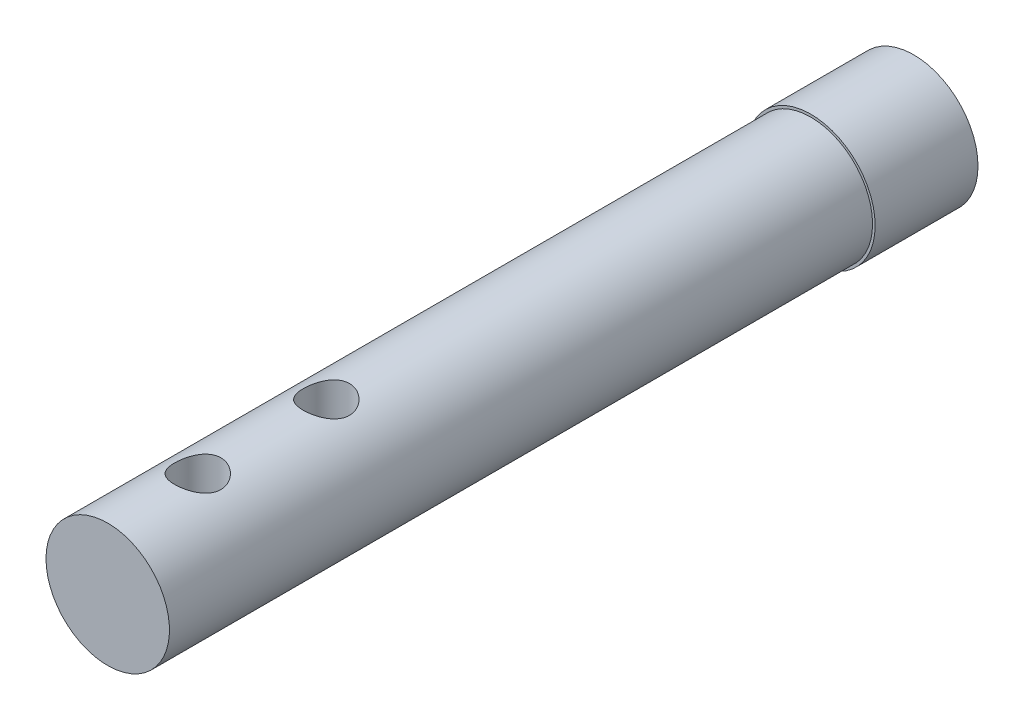
ISO-10303-21;
HEADER;
FILE_DESCRIPTION(('STEP AP214'),'2;1');
FILE_NAME('part.step','',(''),(''),'','','');
FILE_SCHEMA(('AUTOMOTIVE_DESIGN { 1 0 10303 214 1 1 1 1 }'));
ENDSEC;
DATA;
#1=APPLICATION_CONTEXT('core data for automotive mechanical design processes');
#2=APPLICATION_PROTOCOL_DEFINITION('international standard','automotive_design',2000,#1);
#3=PRODUCT_CONTEXT('',#1,'mechanical');
#4=PRODUCT('Part','Part','',(#3));
#5=PRODUCT_RELATED_PRODUCT_CATEGORY('part','',(#4));
#6=PRODUCT_DEFINITION_FORMATION('','',#4);
#7=PRODUCT_DEFINITION_CONTEXT('part definition',#1,'design');
#8=PRODUCT_DEFINITION('design','',#6,#7);
#9=PRODUCT_DEFINITION_SHAPE('','',#8);
#10=(LENGTH_UNIT() NAMED_UNIT(*) SI_UNIT(.MILLI.,.METRE.));
#11=(NAMED_UNIT(*) PLANE_ANGLE_UNIT() SI_UNIT($,.RADIAN.));
#12=(NAMED_UNIT(*) SI_UNIT($,.STERADIAN.) SOLID_ANGLE_UNIT());
#13=UNCERTAINTY_MEASURE_WITH_UNIT(LENGTH_MEASURE(1.E-05),#10,'distance_accuracy_value','');
#14=(GEOMETRIC_REPRESENTATION_CONTEXT(3) GLOBAL_UNCERTAINTY_ASSIGNED_CONTEXT((#13)) GLOBAL_UNIT_ASSIGNED_CONTEXT((#10,
#11,#12)) REPRESENTATION_CONTEXT('',''));
#15=CARTESIAN_POINT('',(0.,0.,0.));
#16=DIRECTION('',(0.,0.,1.));
#17=DIRECTION('',(1.,0.,0.));
#18=AXIS2_PLACEMENT_3D('',#15,#16,#17);
#19=CARTESIAN_POINT('',(0.,0.,35.));
#20=DIRECTION('',(0.,0.,-1.));
#21=DIRECTION('',(-1.,0.,0.));
#22=AXIS2_PLACEMENT_3D('',#19,#20,#21);
#23=CYLINDRICAL_SURFACE('',#22,12.5);
#24=CARTESIAN_POINT('',(0.,0.,35.));
#25=DIRECTION('',(0.,0.,1.));
#26=DIRECTION('',(1.,0.,0.));
#27=AXIS2_PLACEMENT_3D('',#24,#25,#26);
#28=CIRCLE('',#27,12.5);
#29=CARTESIAN_POINT('',(12.5,0.,35.));
#30=VERTEX_POINT('',#29);
#31=EDGE_CURVE('E42',#30,#30,#28,.T.);
#32=ORIENTED_EDGE('',*,*,#31,.F.);
#33=EDGE_LOOP('',(#32));
#34=FACE_BOUND('',#33,.T.);
#35=CARTESIAN_POINT('',(0.,0.,15.));
#36=DIRECTION('',(0.,0.,1.));
#37=DIRECTION('',(1.,0.,0.));
#38=AXIS2_PLACEMENT_3D('',#35,#36,#37);
#39=CIRCLE('',#38,12.5);
#40=CARTESIAN_POINT('',(12.5,0.,15.));
#41=VERTEX_POINT('',#40);
#42=EDGE_CURVE('E47',#41,#41,#39,.T.);
#43=ORIENTED_EDGE('',*,*,#42,.T.);
#44=EDGE_LOOP('',(#43));
#45=FACE_BOUND('',#44,.T.);
#46=ADVANCED_FACE('F35',(#34,#45),#23,.T.);
#47=CARTESIAN_POINT('',(0.,0.,35.));
#48=DIRECTION('',(0.,0.,1.));
#49=DIRECTION('',(1.,0.,0.));
#50=AXIS2_PLACEMENT_3D('',#47,#48,#49);
#51=PLANE('',#50);
#52=CARTESIAN_POINT('',(0.,0.,35.));
#53=DIRECTION('',(0.,0.,1.));
#54=DIRECTION('',(1.,0.,0.));
#55=AXIS2_PLACEMENT_3D('',#52,#53,#54);
#56=CIRCLE('',#55,12.);
#57=CARTESIAN_POINT('',(12.,0.,35.));
#58=VERTEX_POINT('',#57);
#59=EDGE_CURVE('E10',#58,#58,#56,.T.);
#60=ORIENTED_EDGE('',*,*,#59,.F.);
#61=EDGE_LOOP('',(#60));
#62=FACE_BOUND('',#61,.T.);
#63=ORIENTED_EDGE('',*,*,#31,.T.);
#64=EDGE_LOOP('',(#63));
#65=FACE_BOUND('',#64,.T.);
#66=ADVANCED_FACE('F103',(#62,#65),#51,.T.);
#67=CARTESIAN_POINT('',(0.,0.,15.));
#68=DIRECTION('',(0.,0.,1.));
#69=DIRECTION('',(1.,0.,0.));
#70=AXIS2_PLACEMENT_3D('',#67,#68,#69);
#71=PLANE('',#70);
#72=ORIENTED_EDGE('',*,*,#42,.F.);
#73=EDGE_LOOP('',(#72));
#74=FACE_BOUND('',#73,.T.);
#75=ADVANCED_FACE('F108',(#74),#71,.F.);
#76=CARTESIAN_POINT('',(0.,0.,174.2));
#77=DIRECTION('',(0.,0.,-1.));
#78=DIRECTION('',(-1.,0.,0.));
#79=AXIS2_PLACEMENT_3D('',#76,#77,#78);
#80=CYLINDRICAL_SURFACE('',#79,12.);
#81=CARTESIAN_POINT('',(0.,0.,171.7));
#82=DIRECTION('',(0.,0.,-1.));
#83=DIRECTION('',(-1.,0.,0.));
#84=AXIS2_PLACEMENT_3D('',#81,#82,#83);
#85=CIRCLE('',#84,12.);
#86=CARTESIAN_POINT('',(-12.,0.,171.7));
#87=VERTEX_POINT('',#86);
#88=EDGE_CURVE('E38',#87,#87,#85,.T.);
#89=ORIENTED_EDGE('',*,*,#88,.T.);
#90=EDGE_LOOP('',(#89));
#91=FACE_BOUND('',#90,.T.);
#92=CARTESIAN_POINT('',(0.,-12.,133.7));
#93=CARTESIAN_POINT('',(0.121821920216141,-12.0000004149463,133.700000562589));
#94=CARTESIAN_POINT('',(0.243636002691335,-11.9981409348073,133.695049364538));
#95=CARTESIAN_POINT('',(0.486392423781216,-11.9907535477711,133.675293911887));
#96=CARTESIAN_POINT('',(0.607334471202253,-11.9852244680872,133.660486507286));
#97=CARTESIAN_POINT('',(0.847347381687188,-11.970649565472,133.621174413436));
#98=CARTESIAN_POINT('',(0.966419205128135,-11.9616056132673,133.596674882519));
#99=CARTESIAN_POINT('',(1.2019581040135,-11.9402382455256,133.53820576059));
#100=CARTESIAN_POINT('',(1.31842414848255,-11.9279135559973,133.504232490447));
#101=CARTESIAN_POINT('',(1.54765442429004,-11.9003384511568,133.427214849951));
#102=CARTESIAN_POINT('',(1.66042673449101,-11.8850950009216,133.384192050998));
#103=CARTESIAN_POINT('',(1.88185705605879,-11.8520536393113,133.289393964956));
#104=CARTESIAN_POINT('',(1.99051352350809,-11.8342547811235,133.237615432482));
#105=CARTESIAN_POINT('',(2.30927279411985,-11.7776768093622,133.069731594457));
#106=CARTESIAN_POINT('',(2.51234231941558,-11.7356939966761,132.941018203868));
#107=CARTESIAN_POINT('',(2.90206977477989,-11.6455850212357,132.648156633399));
#108=CARTESIAN_POINT('',(3.08780172063125,-11.5972851945296,132.482840477992));
#109=CARTESIAN_POINT('',(3.42974311725175,-11.500801507554,132.123737421702));
#110=CARTESIAN_POINT('',(3.58594353155377,-11.4526176872201,131.929941838426));
#111=CARTESIAN_POINT('',(3.79764477617944,-11.3834841407686,131.617559070828));
#112=CARTESIAN_POINT('',(3.86547493196535,-11.3605705131175,131.507562616254));
#113=CARTESIAN_POINT('',(3.99157408188856,-11.3168804194774,131.281831512047));
#114=CARTESIAN_POINT('',(4.04984690983616,-11.2961030977882,131.166099187672));
#115=CARTESIAN_POINT('',(4.15634309619244,-11.257354412399,130.929634242611));
#116=CARTESIAN_POINT('',(4.20456527896397,-11.2393833770156,130.808901038945));
#117=CARTESIAN_POINT('',(4.29047551547084,-11.2068698048304,130.563350953977));
#118=CARTESIAN_POINT('',(4.32816865016454,-11.1923256148824,130.438536074949));
#119=CARTESIAN_POINT('',(4.3913383306389,-11.167687799886,130.190864282486));
#120=CARTESIAN_POINT('',(4.41724869222401,-11.1574374723367,130.068133574559));
#121=CARTESIAN_POINT('',(4.45874705417236,-11.1409189584307,129.820724885637));
#122=CARTESIAN_POINT('',(4.47433956871922,-11.1346490306496,129.696047780687));
#123=CARTESIAN_POINT('',(4.49504192825722,-11.1263077224061,129.445703904304));
#124=CARTESIAN_POINT('',(4.50015334189904,-11.124235713664,129.320037283793));
#125=CARTESIAN_POINT('',(4.4998396408155,-11.124362586323,129.068723898627));
#126=CARTESIAN_POINT('',(4.49441493477359,-11.1265613020677,128.94307713339));
#127=CARTESIAN_POINT('',(4.47373138181252,-11.1348931002806,128.700345583509));
#128=CARTESIAN_POINT('',(4.45908334347361,-11.1407817124043,128.583200175152));
#129=CARTESIAN_POINT('',(4.42068867776497,-11.1560711786316,128.350631735769));
#130=CARTESIAN_POINT('',(4.39693902815624,-11.1654731993557,128.235209290103));
#131=CARTESIAN_POINT('',(4.31234407385654,-11.1985472030748,127.892770983112));
#132=CARTESIAN_POINT('',(4.23813423625877,-11.2270952052095,127.669371280221));
#133=CARTESIAN_POINT('',(4.05490721343478,-11.294571324263,127.234132319446));
#134=CARTESIAN_POINT('',(3.94525805379047,-11.3336856090865,127.02259174478));
#135=CARTESIAN_POINT('',(3.69468362169031,-11.417826234714,126.620172587469));
#136=CARTESIAN_POINT('',(3.55374755073013,-11.4628546145386,126.429301172593));
#137=CARTESIAN_POINT('',(3.23345300799872,-11.5574411862383,126.060186122089));
#138=CARTESIAN_POINT('',(3.05214885027355,-11.607100429164,125.88365330368));
#139=CARTESIAN_POINT('',(2.66193788370924,-11.7027518394278,125.562986875577));
#140=CARTESIAN_POINT('',(2.45302684040981,-11.7487434424691,125.418858245353));
#141=CARTESIAN_POINT('',(2.00917028059687,-11.8327918458053,125.165208596408));
#142=CARTESIAN_POINT('',(1.77387213379261,-11.8707149483013,125.056257198474));
#143=CARTESIAN_POINT('',(1.28651055931184,-11.9333615492963,124.880052245027));
#144=CARTESIAN_POINT('',(1.03445463312944,-11.9580909097264,124.8127801694));
#145=CARTESIAN_POINT('',(0.535125728885334,-11.9905332973328,124.725131619306));
#146=CARTESIAN_POINT('',(0.288310863440804,-11.9990810722223,124.702452162351));
#147=CARTESIAN_POINT('',(-0.205717430518202,-12.0007768095524,124.697926826798));
#148=CARTESIAN_POINT('',(-0.452930758520925,-11.9939281862917,124.716071894972));
#149=CARTESIAN_POINT('',(-0.930786126866781,-11.9661512982893,124.790930073153));
#150=CARTESIAN_POINT('',(-1.16169991458787,-11.9457741475744,124.846134437354));
#151=CARTESIAN_POINT('',(-1.61082533431484,-11.8935442940439,124.991558411525));
#152=CARTESIAN_POINT('',(-1.82903531000968,-11.8616900987367,125.081782575637));
#153=CARTESIAN_POINT('',(-2.25374302875422,-11.7884888040033,125.297558494317));
#154=CARTESIAN_POINT('',(-2.45970824228689,-11.7468902777666,125.424070377444));
#155=CARTESIAN_POINT('',(-2.8481791439392,-11.6587998753534,125.70775712078));
#156=CARTESIAN_POINT('',(-3.03067612982123,-11.6123061955645,125.864943301224));
#157=CARTESIAN_POINT('',(-3.37808840855275,-11.516200958323,126.216201253386));
#158=CARTESIAN_POINT('',(-3.54136933947529,-11.4665650100461,126.411883953797));
#159=CARTESIAN_POINT('',(-3.8331467865608,-11.372360357102,126.828996752467));
#160=CARTESIAN_POINT('',(-3.96164017919756,-11.3277921076647,127.050429160208));
#161=CARTESIAN_POINT('',(-4.12541953452076,-11.2687303690453,127.397922796397));
#162=CARTESIAN_POINT('',(-4.17527938653559,-11.2503030894951,127.516647329586));
#163=CARTESIAN_POINT('',(-4.26475585416723,-11.2166905930926,127.758323845116));
#164=CARTESIAN_POINT('',(-4.30437682733462,-11.2015039975232,127.881274003754));
#165=CARTESIAN_POINT('',(-4.37296242168506,-11.1749073223601,128.130466472104));
#166=CARTESIAN_POINT('',(-4.40193024471254,-11.163496108165,128.256707780413));
#167=CARTESIAN_POINT('',(-4.44890662829911,-11.1448585297206,128.51151813959));
#168=CARTESIAN_POINT('',(-4.46691595320739,-11.1376318736025,128.640087027466));
#169=CARTESIAN_POINT('',(-4.4909611175474,-11.1279568107625,128.890138338187));
#170=CARTESIAN_POINT('',(-4.4976937576826,-11.1252304971503,129.011543515748));
#171=CARTESIAN_POINT('',(-4.50131029580419,-11.1237678185175,129.254568299403));
#172=CARTESIAN_POINT('',(-4.49819087218451,-11.1250327991546,129.376187963996));
#173=CARTESIAN_POINT('',(-4.48213280066959,-11.131512007523,129.618611778483));
#174=CARTESIAN_POINT('',(-4.46919877710471,-11.1367243753675,129.739416285416));
#175=CARTESIAN_POINT('',(-4.4336489114592,-11.150924738849,129.979410101132));
#176=CARTESIAN_POINT('',(-4.41102942370239,-11.1599141561698,130.098598784262));
#177=CARTESIAN_POINT('',(-4.35718066722756,-11.1810458214159,130.330811506595));
#178=CARTESIAN_POINT('',(-4.32623979458421,-11.1930817833517,130.443912139277));
#179=CARTESIAN_POINT('',(-4.25575591081443,-11.220069483486,130.667056271898));
#180=CARTESIAN_POINT('',(-4.216209885475,-11.23502224319,130.777098685333));
#181=CARTESIAN_POINT('',(-4.08512625929659,-11.2836374066331,131.101595505612));
#182=CARTESIAN_POINT('',(-3.98110253179988,-11.3210734609741,131.310592817196));
#183=CARTESIAN_POINT('',(-3.73655960136618,-11.4041928736043,131.719509886323));
#184=CARTESIAN_POINT('',(-3.59441315608531,-11.4502056852775,131.918379513829));
#185=CARTESIAN_POINT('',(-3.28000639093494,-11.5441926723435,132.290437563583));
#186=CARTESIAN_POINT('',(-3.10773650011229,-11.5921674673836,132.463617791262));
#187=CARTESIAN_POINT('',(-2.82485495768736,-11.6632064644304,132.705245875948));
#188=CARTESIAN_POINT('',(-2.72355677041139,-11.6873329442322,132.784523984934));
#189=CARTESIAN_POINT('',(-2.5143325103599,-11.7341212355869,132.934254321495));
#190=CARTESIAN_POINT('',(-2.40640888366377,-11.7567835814237,133.004709777492));
#191=CARTESIAN_POINT('',(-2.18454509687348,-11.8000231112314,133.136294134108));
#192=CARTESIAN_POINT('',(-2.07060177268691,-11.8205991816831,133.197418062869));
#193=CARTESIAN_POINT('',(-1.83755175113718,-11.8590616275344,133.309759993606));
#194=CARTESIAN_POINT('',(-1.71844727331547,-11.8769491446375,133.36098220304));
#195=CARTESIAN_POINT('',(-1.47053797162902,-11.9102407175975,133.455097964792));
#196=CARTESIAN_POINT('',(-1.34153686175291,-11.9255011706843,133.497526838323));
#197=CARTESIAN_POINT('',(-1.07989915577463,-11.9520331999052,133.570612963128));
#198=CARTESIAN_POINT('',(-0.947264179674953,-11.9633065233273,133.601275371348));
#199=CARTESIAN_POINT('',(-0.679492491904581,-11.9814979813589,133.650485060083));
#200=CARTESIAN_POINT('',(-0.544356226207072,-11.9884168847946,133.669034479318));
#201=CARTESIAN_POINT('',(-0.272809934790551,-11.9976674031164,133.693790938277));
#202=CARTESIAN_POINT('',(-0.136400054481801,-11.9999995353981,133.699999370088));
#203=CARTESIAN_POINT('',(0.,-12.,133.7));
#204=B_SPLINE_CURVE_WITH_KNOTS('',3,(#92,#93,#94,#95,#96,#97,#98,#99,#100,#101,#102,#103,#104,
#105,#106,#107,#108,#109,#110,#111,#112,#113,#114,#115,#116,#117,#118,#119,#120,#121,#122,#123,
#124,#125,#126,#127,#128,#129,#130,#131,#132,#133,#134,#135,#136,#137,#138,#139,#140,#141,#142,
#143,#144,#145,#146,#147,#148,#149,#150,#151,#152,#153,#154,#155,#156,#157,#158,#159,#160,#161,
#162,#163,#164,#165,#166,#167,#168,#169,#170,#171,#172,#173,#174,#175,#176,#177,#178,#179,#180,
#181,#182,#183,#184,#185,#186,#187,#188,#189,#190,#191,#192,#193,#194,#195,#196,#197,#198,#199,
#200,#201,#202,#203),.UNSPECIFIED.,.T.,.F.,(4,2,2,2,2,2,2,2,2,2,2,2,2,2,2,2,2,2,2,2,2,2,2,2,2,2,
2,2,2,2,2,2,2,2,2,2,2,2,2,2,2,2,2,2,2,2,2,2,2,2,2,2,2,2,2,4),(0.,0.365338024506953,
0.730792865566528,1.09605346575198,1.46145611308566,1.82599742407275,2.19067415273864,
2.91947018392637,3.67616860257937,4.43309819286657,4.82642681378567,5.21959726757261,
5.6128136852447,6.00584002102328,6.38291145568139,6.75981780772976,7.13666774608809,
7.5135030671805,7.86768402280124,8.22198268815958,8.92994647641832,9.65130458621122,
10.3729120569284,11.143016934675,11.9132400717527,12.6953735931829,13.477159325566,
14.2173829236784,14.9574423863163,15.6690654723159,16.3807811322343,17.1134089903886,
17.8463077351967,18.6217279182704,19.3972177022049,19.7870381951626,20.1766925107005,
20.5662296182681,20.9557395527225,21.3201489316714,21.6846811837187,22.0490417862153,
22.4135396573091,22.7667469946614,23.1200782532196,23.8262105801188,24.5693581369517,
25.3127422403355,25.7049754844993,26.0970647789657,26.4893622558027,26.8814926686161,
27.2908478409866,27.7000233978563,28.1091266894863,28.5181838309154),.UNSPECIFIED.);
#205=CARTESIAN_POINT('',(0.,-12.,133.7));
#206=VERTEX_POINT('',#205);
#207=EDGE_CURVE('E61',#206,#206,#204,.T.);
#208=ORIENTED_EDGE('',*,*,#207,.T.);
#209=EDGE_LOOP('',(#208));
#210=FACE_BOUND('',#209,.T.);
#211=CARTESIAN_POINT('',(0.,12.,133.7));
#212=CARTESIAN_POINT('',(-0.121821920216148,12.0000004149463,133.700000562589));
#213=CARTESIAN_POINT('',(-0.243636002691342,11.9981409348073,133.695049364538));
#214=CARTESIAN_POINT('',(-0.486392423781223,11.9907535477711,133.675293911887));
#215=CARTESIAN_POINT('',(-0.60733447120226,11.9852244680872,133.660486507286));
#216=CARTESIAN_POINT('',(-0.847347381687196,11.970649565472,133.621174413436));
#217=CARTESIAN_POINT('',(-0.966419205128143,11.9616056132673,133.596674882519));
#218=CARTESIAN_POINT('',(-1.20195810401351,11.9402382455256,133.53820576059));
#219=CARTESIAN_POINT('',(-1.31842414848256,11.9279135559973,133.504232490447));
#220=CARTESIAN_POINT('',(-1.54765442429005,11.9003384511568,133.427214849951));
#221=CARTESIAN_POINT('',(-1.66042673449102,11.8850950009216,133.384192050998));
#222=CARTESIAN_POINT('',(-1.88185705605881,11.8520536393113,133.289393964956));
#223=CARTESIAN_POINT('',(-1.9905135235081,11.8342547811235,133.237615432482));
#224=CARTESIAN_POINT('',(-2.30927279411986,11.7776768093622,133.069731594457));
#225=CARTESIAN_POINT('',(-2.51234231941559,11.7356939966761,132.941018203868));
#226=CARTESIAN_POINT('',(-2.9020697747799,11.6455850212357,132.648156633399));
#227=CARTESIAN_POINT('',(-3.08780172063126,11.5972851945296,132.482840477992));
#228=CARTESIAN_POINT('',(-3.42974311725176,11.500801507554,132.123737421702));
#229=CARTESIAN_POINT('',(-3.58594353155377,11.4526176872201,131.929941838426));
#230=CARTESIAN_POINT('',(-3.79764477617945,11.3834841407686,131.617559070828));
#231=CARTESIAN_POINT('',(-3.86547493196536,11.3605705131175,131.507562616254));
#232=CARTESIAN_POINT('',(-3.99157408188856,11.3168804194774,131.281831512047));
#233=CARTESIAN_POINT('',(-4.04984690983617,11.2961030977882,131.166099187672));
#234=CARTESIAN_POINT('',(-4.15634309619245,11.257354412399,130.929634242611));
#235=CARTESIAN_POINT('',(-4.20456527896398,11.2393833770156,130.808901038945));
#236=CARTESIAN_POINT('',(-4.29047551547085,11.2068698048304,130.563350953977));
#237=CARTESIAN_POINT('',(-4.32816865016455,11.1923256148824,130.438536074949));
#238=CARTESIAN_POINT('',(-4.3913383306389,11.167687799886,130.190864282486));
#239=CARTESIAN_POINT('',(-4.41724869222402,11.1574374723367,130.068133574559));
#240=CARTESIAN_POINT('',(-4.45874705417237,11.1409189584307,129.820724885637));
#241=CARTESIAN_POINT('',(-4.47433956871923,11.1346490306496,129.696047780687));
#242=CARTESIAN_POINT('',(-4.49504192825722,11.1263077224061,129.445703904304));
#243=CARTESIAN_POINT('',(-4.50015334189905,11.124235713664,129.320037283793));
#244=CARTESIAN_POINT('',(-4.49983964081551,11.124362586323,129.068723898627));
#245=CARTESIAN_POINT('',(-4.4944149347736,11.1265613020677,128.94307713339));
#246=CARTESIAN_POINT('',(-4.47373138181252,11.1348931002806,128.700345583509));
#247=CARTESIAN_POINT('',(-4.45908334347362,11.1407817124043,128.583200175152));
#248=CARTESIAN_POINT('',(-4.42068867776498,11.1560711786316,128.350631735769));
#249=CARTESIAN_POINT('',(-4.39693902815624,11.1654731993557,128.235209290103));
#250=CARTESIAN_POINT('',(-4.31234407385655,11.1985472030748,127.892770983112));
#251=CARTESIAN_POINT('',(-4.23813423625877,11.2270952052095,127.669371280221));
#252=CARTESIAN_POINT('',(-4.05490721343479,11.294571324263,127.234132319446));
#253=CARTESIAN_POINT('',(-3.94525805379048,11.3336856090865,127.02259174478));
#254=CARTESIAN_POINT('',(-3.69468362169032,11.417826234714,126.620172587469));
#255=CARTESIAN_POINT('',(-3.55374755073014,11.4628546145386,126.429301172593));
#256=CARTESIAN_POINT('',(-3.23345300799872,11.5574411862383,126.060186122089));
#257=CARTESIAN_POINT('',(-3.05214885027355,11.607100429164,125.88365330368));
#258=CARTESIAN_POINT('',(-2.66193788370925,11.7027518394278,125.562986875577));
#259=CARTESIAN_POINT('',(-2.45302684040981,11.7487434424691,125.418858245353));
#260=CARTESIAN_POINT('',(-2.00917028059688,11.8327918458053,125.165208596408));
#261=CARTESIAN_POINT('',(-1.77387213379261,11.8707149483013,125.056257198474));
#262=CARTESIAN_POINT('',(-1.28651055931184,11.9333615492963,124.880052245027));
#263=CARTESIAN_POINT('',(-1.03445463312944,11.9580909097264,124.8127801694));
#264=CARTESIAN_POINT('',(-0.535125728885343,11.9905332973328,124.725131619306));
#265=CARTESIAN_POINT('',(-0.288310863440812,11.9990810722223,124.702452162351));
#266=CARTESIAN_POINT('',(0.205717430518194,12.0007768095524,124.697926826798));
#267=CARTESIAN_POINT('',(0.452930758520917,11.9939281862917,124.716071894972));
#268=CARTESIAN_POINT('',(0.930786126866772,11.9661512982893,124.790930073153));
#269=CARTESIAN_POINT('',(1.16169991458786,11.9457741475744,124.846134437354));
#270=CARTESIAN_POINT('',(1.61082533431484,11.8935442940439,124.991558411525));
#271=CARTESIAN_POINT('',(1.82903531000967,11.8616900987367,125.081782575637));
#272=CARTESIAN_POINT('',(2.25374302875422,11.7884888040033,125.297558494317));
#273=CARTESIAN_POINT('',(2.45970824228691,11.7468902777666,125.424070377444));
#274=CARTESIAN_POINT('',(2.84817914393921,11.6587998753534,125.70775712078));
#275=CARTESIAN_POINT('',(3.03067612982124,11.6123061955645,125.864943301224));
#276=CARTESIAN_POINT('',(3.37808840855274,11.516200958323,126.216201253386));
#277=CARTESIAN_POINT('',(3.54136933947528,11.4665650100462,126.411883953797));
#278=CARTESIAN_POINT('',(3.8331467865608,11.372360357102,126.828996752467));
#279=CARTESIAN_POINT('',(3.96164017919755,11.3277921076647,127.050429160208));
#280=CARTESIAN_POINT('',(4.12541953452075,11.2687303690453,127.397922796397));
#281=CARTESIAN_POINT('',(4.17527938653558,11.2503030894951,127.516647329586));
#282=CARTESIAN_POINT('',(4.26475585416722,11.2166905930926,127.758323845116));
#283=CARTESIAN_POINT('',(4.30437682733461,11.2015039975232,127.881274003754));
#284=CARTESIAN_POINT('',(4.37296242168505,11.1749073223601,128.130466472104));
#285=CARTESIAN_POINT('',(4.40193024471254,11.163496108165,128.256707780413));
#286=CARTESIAN_POINT('',(4.44890662829911,11.1448585297206,128.51151813959));
#287=CARTESIAN_POINT('',(4.46691595320738,11.1376318736025,128.640087027466));
#288=CARTESIAN_POINT('',(4.49096111754739,11.1279568107625,128.890138338187));
#289=CARTESIAN_POINT('',(4.49769375768259,11.1252304971503,129.011543515748));
#290=CARTESIAN_POINT('',(4.50131029580418,11.1237678185175,129.254568299403));
#291=CARTESIAN_POINT('',(4.4981908721845,11.1250327991546,129.376187963996));
#292=CARTESIAN_POINT('',(4.48213280066958,11.131512007523,129.618611778483));
#293=CARTESIAN_POINT('',(4.46919877710471,11.1367243753675,129.739416285416));
#294=CARTESIAN_POINT('',(4.4336489114592,11.150924738849,129.979410101132));
#295=CARTESIAN_POINT('',(4.41102942370238,11.1599141561698,130.098598784262));
#296=CARTESIAN_POINT('',(4.35718066722755,11.1810458214159,130.330811506595));
#297=CARTESIAN_POINT('',(4.3262397945842,11.1930817833517,130.443912139277));
#298=CARTESIAN_POINT('',(4.25575591081443,11.220069483486,130.667056271898));
#299=CARTESIAN_POINT('',(4.21620988547499,11.23502224319,130.777098685333));
#300=CARTESIAN_POINT('',(4.08512625929658,11.2836374066331,131.101595505612));
#301=CARTESIAN_POINT('',(3.98110253179987,11.3210734609741,131.310592817196));
#302=CARTESIAN_POINT('',(3.73655960136618,11.4041928736043,131.719509886323));
#303=CARTESIAN_POINT('',(3.5944131560853,11.4502056852775,131.918379513829));
#304=CARTESIAN_POINT('',(3.28000639093493,11.5441926723435,132.290437563583));
#305=CARTESIAN_POINT('',(3.10773650011228,11.5921674673836,132.463617791262));
#306=CARTESIAN_POINT('',(2.82485495768736,11.6632064644304,132.705245875948));
#307=CARTESIAN_POINT('',(2.72355677041138,11.6873329442322,132.784523984934));
#308=CARTESIAN_POINT('',(2.51433251035989,11.7341212355869,132.934254321495));
#309=CARTESIAN_POINT('',(2.40640888366376,11.7567835814237,133.004709777492));
#310=CARTESIAN_POINT('',(2.18454509687347,11.8000231112314,133.136294134108));
#311=CARTESIAN_POINT('',(2.0706017726869,11.8205991816831,133.197418062869));
#312=CARTESIAN_POINT('',(1.83755175113717,11.8590616275344,133.309759993606));
#313=CARTESIAN_POINT('',(1.71844727331546,11.8769491446375,133.36098220304));
#314=CARTESIAN_POINT('',(1.47053797162901,11.9102407175975,133.455097964792));
#315=CARTESIAN_POINT('',(1.3415368617529,11.9255011706843,133.497526838323));
#316=CARTESIAN_POINT('',(1.07989915577463,11.9520331999052,133.570612963128));
#317=CARTESIAN_POINT('',(0.947264179674952,11.9633065233273,133.601275371348));
#318=CARTESIAN_POINT('',(0.67949249190458,11.9814979813589,133.650485060083));
#319=CARTESIAN_POINT('',(0.54435622620707,11.9884168847946,133.669034479318));
#320=CARTESIAN_POINT('',(0.272809934790547,11.9976674031164,133.693790938277));
#321=CARTESIAN_POINT('',(0.136400054481796,11.9999995353981,133.699999370088));
#322=CARTESIAN_POINT('',(0.,12.,133.7));
#323=B_SPLINE_CURVE_WITH_KNOTS('',3,(#211,#212,#213,#214,#215,#216,#217,#218,#219,#220,#221,
#222,#223,#224,#225,#226,#227,#228,#229,#230,#231,#232,#233,#234,#235,#236,#237,#238,#239,#240,
#241,#242,#243,#244,#245,#246,#247,#248,#249,#250,#251,#252,#253,#254,#255,#256,#257,#258,#259,
#260,#261,#262,#263,#264,#265,#266,#267,#268,#269,#270,#271,#272,#273,#274,#275,#276,#277,#278,
#279,#280,#281,#282,#283,#284,#285,#286,#287,#288,#289,#290,#291,#292,#293,#294,#295,#296,#297,
#298,#299,#300,#301,#302,#303,#304,#305,#306,#307,#308,#309,#310,#311,#312,#313,#314,#315,#316,
#317,#318,#319,#320,#321,#322),.UNSPECIFIED.,.T.,.F.,(4,2,2,2,2,2,2,2,2,2,2,2,2,2,2,2,2,2,2,2,2,
2,2,2,2,2,2,2,2,2,2,2,2,2,2,2,2,2,2,2,2,2,2,2,2,2,2,2,2,2,2,2,2,2,2,4),(0.,0.365338024506953,
0.730792865566528,1.09605346575198,1.46145611308566,1.82599742407276,2.19067415273864,
2.91947018392637,3.67616860257937,4.43309819286657,4.82642681378567,5.21959726757261,
5.6128136852447,6.00584002102328,6.38291145568139,6.75981780772976,7.13666774608809,
7.5135030671805,7.86768402280124,8.22198268815958,8.92994647641832,9.65130458621122,
10.3729120569284,11.1430169346751,11.9132400717527,12.6953735931829,13.477159325566,
14.2173829236784,14.9574423863163,15.6690654723159,16.3807811322343,17.1134089903887,
17.8463077351967,18.6217279182704,19.3972177022049,19.7870381951626,20.1766925107005,
20.5662296182681,20.9557395527225,21.3201489316714,21.6846811837187,22.0490417862153,
22.4135396573091,22.7667469946614,23.1200782532196,23.8262105801188,24.5693581369517,
25.3127422403355,25.7049754844993,26.0970647789657,26.4893622558027,26.8814926686161,
27.2908478409866,27.7000233978563,28.1091266894863,28.5181838309154),.UNSPECIFIED.);
#324=CARTESIAN_POINT('',(0.,12.,133.7));
#325=VERTEX_POINT('',#324);
#326=EDGE_CURVE('E82',#325,#325,#323,.T.);
#327=ORIENTED_EDGE('',*,*,#326,.T.);
#328=EDGE_LOOP('',(#327));
#329=FACE_BOUND('',#328,.T.);
#330=CARTESIAN_POINT('',(0.,-12.,158.7));
#331=CARTESIAN_POINT('',(0.121821920216141,-12.0000004149463,158.700000562589));
#332=CARTESIAN_POINT('',(0.243636002691335,-11.9981409348073,158.695049364538));
#333=CARTESIAN_POINT('',(0.486392423781216,-11.9907535477711,158.675293911887));
#334=CARTESIAN_POINT('',(0.607334471202253,-11.9852244680872,158.660486507286));
#335=CARTESIAN_POINT('',(0.84734738168719,-11.970649565472,158.621174413436));
#336=CARTESIAN_POINT('',(0.966419205128139,-11.9616056132673,158.596674882519));
#337=CARTESIAN_POINT('',(1.20195810401351,-11.9402382455256,158.53820576059));
#338=CARTESIAN_POINT('',(1.31842414848256,-11.9279135559973,158.504232490447));
#339=CARTESIAN_POINT('',(1.54765442429003,-11.9003384511568,158.427214849951));
#340=CARTESIAN_POINT('',(1.660426734491,-11.8850950009216,158.384192050998));
#341=CARTESIAN_POINT('',(1.88185705605878,-11.8520536393113,158.289393964957));
#342=CARTESIAN_POINT('',(1.99051352350808,-11.8342547811235,158.237615432482));
#343=CARTESIAN_POINT('',(2.30927279411985,-11.7776768093622,158.069731594457));
#344=CARTESIAN_POINT('',(2.51234231941558,-11.7356939966761,157.941018203868));
#345=CARTESIAN_POINT('',(2.90206977477989,-11.6455850212357,157.648156633399));
#346=CARTESIAN_POINT('',(3.08780172063126,-11.5972851945296,157.482840477992));
#347=CARTESIAN_POINT('',(3.42974311725176,-11.500801507554,157.123737421702));
#348=CARTESIAN_POINT('',(3.58594353155377,-11.4526176872201,156.929941838426));
#349=CARTESIAN_POINT('',(3.79764477617944,-11.3834841407686,156.617559070828));
#350=CARTESIAN_POINT('',(3.86547493196534,-11.3605705131175,156.507562616254));
#351=CARTESIAN_POINT('',(3.99157408188855,-11.3168804194774,156.281831512047));
#352=CARTESIAN_POINT('',(4.04984690983615,-11.2961030977882,156.166099187672));
#353=CARTESIAN_POINT('',(4.15634309619243,-11.2573544123991,155.929634242611));
#354=CARTESIAN_POINT('',(4.20456527896396,-11.2393833770156,155.808901038945));
#355=CARTESIAN_POINT('',(4.29047551547084,-11.2068698048304,155.563350953977));
#356=CARTESIAN_POINT('',(4.32816865016454,-11.1923256148824,155.438536074949));
#357=CARTESIAN_POINT('',(4.39133833063889,-11.167687799886,155.190864282486));
#358=CARTESIAN_POINT('',(4.41724869222401,-11.1574374723367,155.068133574559));
#359=CARTESIAN_POINT('',(4.45874705417236,-11.1409189584307,154.820724885637));
#360=CARTESIAN_POINT('',(4.47433956871922,-11.1346490306496,154.696047780687));
#361=CARTESIAN_POINT('',(4.49504192825721,-11.1263077224061,154.445703904304));
#362=CARTESIAN_POINT('',(4.50015334189904,-11.124235713664,154.320037283793));
#363=CARTESIAN_POINT('',(4.4998396408155,-11.124362586323,154.068723898627));
#364=CARTESIAN_POINT('',(4.49441493477359,-11.1265613020677,153.94307713339));
#365=CARTESIAN_POINT('',(4.47373138181252,-11.1348931002806,153.700345583509));
#366=CARTESIAN_POINT('',(4.45908334347361,-11.1407817124043,153.583200175152));
#367=CARTESIAN_POINT('',(4.42068867776497,-11.1560711786316,153.350631735769));
#368=CARTESIAN_POINT('',(4.39693902815624,-11.1654731993557,153.235209290103));
#369=CARTESIAN_POINT('',(4.31234407385654,-11.1985472030748,152.892770983111));
#370=CARTESIAN_POINT('',(4.23813423625877,-11.2270952052095,152.669371280221));
#371=CARTESIAN_POINT('',(4.05490721343479,-11.294571324263,152.234132319446));
#372=CARTESIAN_POINT('',(3.94525805379047,-11.3336856090865,152.02259174478));
#373=CARTESIAN_POINT('',(3.69468362169031,-11.417826234714,151.620172587469));
#374=CARTESIAN_POINT('',(3.55374755073013,-11.4628546145386,151.429301172593));
#375=CARTESIAN_POINT('',(3.23345300799872,-11.5574411862383,151.060186122089));
#376=CARTESIAN_POINT('',(3.05214885027355,-11.607100429164,150.88365330368));
#377=CARTESIAN_POINT('',(2.66193788370924,-11.7027518394278,150.562986875577));
#378=CARTESIAN_POINT('',(2.45302684040981,-11.7487434424691,150.418858245353));
#379=CARTESIAN_POINT('',(2.00917028059687,-11.8327918458053,150.165208596408));
#380=CARTESIAN_POINT('',(1.77387213379261,-11.8707149483013,150.056257198474));
#381=CARTESIAN_POINT('',(1.28651055931183,-11.9333615492963,149.880052245027));
#382=CARTESIAN_POINT('',(1.03445463312943,-11.9580909097264,149.8127801694));
#383=CARTESIAN_POINT('',(0.535125728885332,-11.9905332973328,149.725131619306));
#384=CARTESIAN_POINT('',(0.288310863440802,-11.9990810722223,149.702452162351));
#385=CARTESIAN_POINT('',(-0.205717430518205,-12.0007768095524,149.697926826798));
#386=CARTESIAN_POINT('',(-0.452930758520928,-11.9939281862917,149.716071894972));
#387=CARTESIAN_POINT('',(-0.930786126866782,-11.9661512982893,149.790930073153));
#388=CARTESIAN_POINT('',(-1.16169991458787,-11.9457741475744,149.846134437354));
#389=CARTESIAN_POINT('',(-1.61082533431484,-11.8935442940439,149.991558411524));
#390=CARTESIAN_POINT('',(-1.82903531000967,-11.8616900987367,150.081782575637));
#391=CARTESIAN_POINT('',(-2.25374302875423,-11.7884888040033,150.297558494317));
#392=CARTESIAN_POINT('',(-2.4597082422869,-11.7468902777666,150.424070377444));
#393=CARTESIAN_POINT('',(-2.84817914393921,-11.6587998753534,150.70775712078));
#394=CARTESIAN_POINT('',(-3.03067612982124,-11.6123061955645,150.864943301224));
#395=CARTESIAN_POINT('',(-3.37808840855274,-11.516200958323,151.216201253386));
#396=CARTESIAN_POINT('',(-3.54136933947528,-11.4665650100462,151.411883953797));
#397=CARTESIAN_POINT('',(-3.83314678656079,-11.372360357102,151.828996752467));
#398=CARTESIAN_POINT('',(-3.96164017919755,-11.3277921076647,152.050429160208));
#399=CARTESIAN_POINT('',(-4.12541953452075,-11.2687303690453,152.397922796397));
#400=CARTESIAN_POINT('',(-4.17527938653558,-11.2503030894951,152.516647329586));
#401=CARTESIAN_POINT('',(-4.26475585416722,-11.2166905930926,152.758323845116));
#402=CARTESIAN_POINT('',(-4.30437682733461,-11.2015039975232,152.881274003754));
#403=CARTESIAN_POINT('',(-4.37296242168505,-11.1749073223601,153.130466472104));
#404=CARTESIAN_POINT('',(-4.40193024471254,-11.163496108165,153.256707780413));
#405=CARTESIAN_POINT('',(-4.44890662829911,-11.1448585297206,153.51151813959));
#406=CARTESIAN_POINT('',(-4.46691595320738,-11.1376318736025,153.640087027466));
#407=CARTESIAN_POINT('',(-4.4909611175474,-11.1279568107625,153.890138338187));
#408=CARTESIAN_POINT('',(-4.4976937576826,-11.1252304971503,154.011543515748));
#409=CARTESIAN_POINT('',(-4.50131029580419,-11.1237678185175,154.254568299403));
#410=CARTESIAN_POINT('',(-4.49819087218451,-11.1250327991546,154.376187963996));
#411=CARTESIAN_POINT('',(-4.48213280066959,-11.131512007523,154.618611778483));
#412=CARTESIAN_POINT('',(-4.46919877710471,-11.1367243753675,154.739416285416));
#413=CARTESIAN_POINT('',(-4.4336489114592,-11.150924738849,154.979410101132));
#414=CARTESIAN_POINT('',(-4.41102942370239,-11.1599141561698,155.098598784262));
#415=CARTESIAN_POINT('',(-4.35718066722756,-11.1810458214159,155.330811506595));
#416=CARTESIAN_POINT('',(-4.3262397945842,-11.1930817833517,155.443912139277));
#417=CARTESIAN_POINT('',(-4.25575591081442,-11.220069483486,155.667056271898));
#418=CARTESIAN_POINT('',(-4.21620988547499,-11.23502224319,155.777098685333));
#419=CARTESIAN_POINT('',(-4.08512625929658,-11.2836374066331,156.101595505612));
#420=CARTESIAN_POINT('',(-3.98110253179987,-11.3210734609741,156.310592817196));
#421=CARTESIAN_POINT('',(-3.73655960136618,-11.4041928736043,156.719509886323));
#422=CARTESIAN_POINT('',(-3.5944131560853,-11.4502056852775,156.918379513829));
#423=CARTESIAN_POINT('',(-3.28000639093493,-11.5441926723435,157.290437563583));
#424=CARTESIAN_POINT('',(-3.10773650011228,-11.5921674673836,157.463617791262));
#425=CARTESIAN_POINT('',(-2.82485495768736,-11.6632064644304,157.705245875948));
#426=CARTESIAN_POINT('',(-2.72355677041139,-11.6873329442322,157.784523984934));
#427=CARTESIAN_POINT('',(-2.5143325103599,-11.7341212355869,157.934254321495));
#428=CARTESIAN_POINT('',(-2.40640888366377,-11.7567835814237,158.004709777492));
#429=CARTESIAN_POINT('',(-2.18454509687348,-11.8000231112314,158.136294134108));
#430=CARTESIAN_POINT('',(-2.0706017726869,-11.8205991816831,158.197418062869));
#431=CARTESIAN_POINT('',(-1.83755175113717,-11.8590616275344,158.309759993606));
#432=CARTESIAN_POINT('',(-1.71844727331546,-11.8769491446375,158.36098220304));
#433=CARTESIAN_POINT('',(-1.47053797162902,-11.9102407175975,158.455097964792));
#434=CARTESIAN_POINT('',(-1.34153686175291,-11.9255011706843,158.497526838323));
#435=CARTESIAN_POINT('',(-1.07989915577463,-11.9520331999052,158.570612963128));
#436=CARTESIAN_POINT('',(-0.947264179674955,-11.9633065233273,158.601275371348));
#437=CARTESIAN_POINT('',(-0.679492491904584,-11.9814979813589,158.650485060083));
#438=CARTESIAN_POINT('',(-0.544356226207075,-11.9884168847946,158.669034479318));
#439=CARTESIAN_POINT('',(-0.272809934790553,-11.9976674031164,158.693790938277));
#440=CARTESIAN_POINT('',(-0.136400054481803,-11.9999995353981,158.699999370088));
#441=CARTESIAN_POINT('',(0.,-12.,158.7));
#442=B_SPLINE_CURVE_WITH_KNOTS('',3,(#330,#331,#332,#333,#334,#335,#336,#337,#338,#339,#340,
#341,#342,#343,#344,#345,#346,#347,#348,#349,#350,#351,#352,#353,#354,#355,#356,#357,#358,#359,
#360,#361,#362,#363,#364,#365,#366,#367,#368,#369,#370,#371,#372,#373,#374,#375,#376,#377,#378,
#379,#380,#381,#382,#383,#384,#385,#386,#387,#388,#389,#390,#391,#392,#393,#394,#395,#396,#397,
#398,#399,#400,#401,#402,#403,#404,#405,#406,#407,#408,#409,#410,#411,#412,#413,#414,#415,#416,
#417,#418,#419,#420,#421,#422,#423,#424,#425,#426,#427,#428,#429,#430,#431,#432,#433,#434,#435,
#436,#437,#438,#439,#440,#441),.UNSPECIFIED.,.T.,.F.,(4,2,2,2,2,2,2,2,2,2,2,2,2,2,2,2,2,2,2,2,2,
2,2,2,2,2,2,2,2,2,2,2,2,2,2,2,2,2,2,2,2,2,2,2,2,2,2,2,2,2,2,2,2,2,2,4),(0.,0.365338024506953,
0.730792865566527,1.09605346575199,1.46145611308566,1.82599742407273,2.19067415273862,
2.91947018392637,3.67616860257939,4.43309819286657,4.82642681378564,5.21959726757258,
5.61281368524467,6.00584002102328,6.38291145568136,6.75981780772973,7.13666774608807,
7.51350306718051,7.86768402280128,8.22198268815959,8.92994647641833,9.65130458621122,
10.3729120569284,11.1430169346751,11.9132400717527,12.6953735931829,13.477159325566,
14.2173829236784,14.9574423863163,15.6690654723159,16.3807811322343,17.1134089903886,
17.8463077351967,18.6217279182704,19.3972177022049,19.7870381951625,20.1766925107005,
20.5662296182681,20.9557395527225,21.3201489316714,21.6846811837187,22.0490417862154,
22.4135396573091,22.7667469946614,23.1200782532196,23.8262105801188,24.5693581369517,
25.3127422403355,25.7049754844993,26.0970647789657,26.4893622558027,26.8814926686161,
27.2908478409866,27.7000233978563,28.1091266894863,28.5181838309154),.UNSPECIFIED.);
#443=CARTESIAN_POINT('',(0.,-12.,158.7));
#444=VERTEX_POINT('',#443);
#445=EDGE_CURVE('E52',#444,#444,#442,.T.);
#446=ORIENTED_EDGE('',*,*,#445,.T.);
#447=EDGE_LOOP('',(#446));
#448=FACE_BOUND('',#447,.T.);
#449=CARTESIAN_POINT('',(0.,12.,158.7));
#450=CARTESIAN_POINT('',(-0.121821920216148,12.0000004149463,158.700000562589));
#451=CARTESIAN_POINT('',(-0.243636002691342,11.9981409348073,158.695049364538));
#452=CARTESIAN_POINT('',(-0.486392423781223,11.9907535477711,158.675293911887));
#453=CARTESIAN_POINT('',(-0.60733447120226,11.9852244680872,158.660486507286));
#454=CARTESIAN_POINT('',(-0.847347381687193,11.970649565472,158.621174413436));
#455=CARTESIAN_POINT('',(-0.966419205128137,11.9616056132673,158.596674882519));
#456=CARTESIAN_POINT('',(-1.2019581040135,11.9402382455256,158.53820576059));
#457=CARTESIAN_POINT('',(-1.31842414848256,11.9279135559973,158.504232490447));
#458=CARTESIAN_POINT('',(-1.54765442429005,11.9003384511568,158.427214849951));
#459=CARTESIAN_POINT('',(-1.66042673449102,11.8850950009216,158.384192050998));
#460=CARTESIAN_POINT('',(-1.8818570560588,11.8520536393113,158.289393964957));
#461=CARTESIAN_POINT('',(-1.99051352350809,11.8342547811235,158.237615432482));
#462=CARTESIAN_POINT('',(-2.30927279411986,11.7776768093622,158.069731594457));
#463=CARTESIAN_POINT('',(-2.51234231941558,11.7356939966761,157.941018203868));
#464=CARTESIAN_POINT('',(-2.9020697747799,11.6455850212357,157.648156633399));
#465=CARTESIAN_POINT('',(-3.08780172063127,11.5972851945296,157.482840477992));
#466=CARTESIAN_POINT('',(-3.42974311725177,11.500801507554,157.123737421702));
#467=CARTESIAN_POINT('',(-3.58594353155378,11.4526176872201,156.929941838426));
#468=CARTESIAN_POINT('',(-3.79764477617944,11.3834841407686,156.617559070828));
#469=CARTESIAN_POINT('',(-3.86547493196535,11.3605705131175,156.507562616254));
#470=CARTESIAN_POINT('',(-3.99157408188855,11.3168804194774,156.281831512047));
#471=CARTESIAN_POINT('',(-4.04984690983616,11.2961030977882,156.166099187672));
#472=CARTESIAN_POINT('',(-4.15634309619244,11.257354412399,155.929634242611));
#473=CARTESIAN_POINT('',(-4.20456527896397,11.2393833770156,155.808901038945));
#474=CARTESIAN_POINT('',(-4.29047551547084,11.2068698048304,155.563350953977));
#475=CARTESIAN_POINT('',(-4.32816865016455,11.1923256148824,155.438536074949));
#476=CARTESIAN_POINT('',(-4.3913383306389,11.167687799886,155.190864282486));
#477=CARTESIAN_POINT('',(-4.41724869222402,11.1574374723367,155.068133574559));
#478=CARTESIAN_POINT('',(-4.45874705417237,11.1409189584307,154.820724885637));
#479=CARTESIAN_POINT('',(-4.47433956871923,11.1346490306496,154.696047780687));
#480=CARTESIAN_POINT('',(-4.49504192825722,11.1263077224061,154.445703904304));
#481=CARTESIAN_POINT('',(-4.50015334189905,11.124235713664,154.320037283793));
#482=CARTESIAN_POINT('',(-4.4998396408155,11.124362586323,154.068723898627));
#483=CARTESIAN_POINT('',(-4.4944149347736,11.1265613020677,153.94307713339));
#484=CARTESIAN_POINT('',(-4.47373138181252,11.1348931002806,153.700345583509));
#485=CARTESIAN_POINT('',(-4.45908334347362,11.1407817124043,153.583200175152));
#486=CARTESIAN_POINT('',(-4.42068867776497,11.1560711786316,153.350631735769));
#487=CARTESIAN_POINT('',(-4.39693902815624,11.1654731993557,153.235209290103));
#488=CARTESIAN_POINT('',(-4.31234407385655,11.1985472030748,152.892770983111));
#489=CARTESIAN_POINT('',(-4.23813423625877,11.2270952052095,152.669371280221));
#490=CARTESIAN_POINT('',(-4.05490721343479,11.294571324263,152.234132319446));
#491=CARTESIAN_POINT('',(-3.94525805379048,11.3336856090865,152.02259174478));
#492=CARTESIAN_POINT('',(-3.69468362169032,11.417826234714,151.620172587469));
#493=CARTESIAN_POINT('',(-3.55374755073014,11.4628546145386,151.429301172593));
#494=CARTESIAN_POINT('',(-3.23345300799872,11.5574411862383,151.060186122089));
#495=CARTESIAN_POINT('',(-3.05214885027355,11.607100429164,150.88365330368));
#496=CARTESIAN_POINT('',(-2.66193788370925,11.7027518394278,150.562986875577));
#497=CARTESIAN_POINT('',(-2.45302684040981,11.7487434424691,150.418858245353));
#498=CARTESIAN_POINT('',(-2.00917028059688,11.8327918458053,150.165208596408));
#499=CARTESIAN_POINT('',(-1.77387213379261,11.8707149483013,150.056257198474));
#500=CARTESIAN_POINT('',(-1.28651055931184,11.9333615492963,149.880052245027));
#501=CARTESIAN_POINT('',(-1.03445463312944,11.9580909097264,149.8127801694));
#502=CARTESIAN_POINT('',(-0.53512572888534,11.9905332973328,149.725131619306));
#503=CARTESIAN_POINT('',(-0.28831086344081,11.9990810722223,149.702452162351));
#504=CARTESIAN_POINT('',(0.205717430518197,12.0007768095524,149.697926826798));
#505=CARTESIAN_POINT('',(0.45293075852092,11.9939281862917,149.716071894972));
#506=CARTESIAN_POINT('',(0.930786126866774,11.9661512982893,149.790930073153));
#507=CARTESIAN_POINT('',(1.16169991458787,11.9457741475744,149.846134437354));
#508=CARTESIAN_POINT('',(1.61082533431484,11.8935442940439,149.991558411524));
#509=CARTESIAN_POINT('',(1.82903531000967,11.8616900987367,150.081782575637));
#510=CARTESIAN_POINT('',(2.25374302875422,11.7884888040033,150.297558494317));
#511=CARTESIAN_POINT('',(2.45970824228691,11.7468902777666,150.424070377444));
#512=CARTESIAN_POINT('',(2.84817914393921,11.6587998753534,150.70775712078));
#513=CARTESIAN_POINT('',(3.03067612982124,11.6123061955645,150.864943301224));
#514=CARTESIAN_POINT('',(3.37808840855274,11.516200958323,151.216201253386));
#515=CARTESIAN_POINT('',(3.54136933947527,11.4665650100462,151.411883953797));
#516=CARTESIAN_POINT('',(3.83314678656079,11.372360357102,151.828996752467));
#517=CARTESIAN_POINT('',(3.96164017919755,11.3277921076647,152.050429160208));
#518=CARTESIAN_POINT('',(4.12541953452075,11.2687303690453,152.397922796397));
#519=CARTESIAN_POINT('',(4.17527938653557,11.2503030894951,152.516647329586));
#520=CARTESIAN_POINT('',(4.26475585416721,11.2166905930926,152.758323845116));
#521=CARTESIAN_POINT('',(4.3043768273346,11.2015039975232,152.881274003754));
#522=CARTESIAN_POINT('',(4.37296242168504,11.1749073223601,153.130466472104));
#523=CARTESIAN_POINT('',(4.40193024471253,11.163496108165,153.256707780413));
#524=CARTESIAN_POINT('',(4.44890662829911,11.1448585297206,153.51151813959));
#525=CARTESIAN_POINT('',(4.46691595320738,11.1376318736025,153.640087027466));
#526=CARTESIAN_POINT('',(4.49096111754739,11.1279568107625,153.890138338187));
#527=CARTESIAN_POINT('',(4.49769375768259,11.1252304971503,154.011543515748));
#528=CARTESIAN_POINT('',(4.50131029580418,11.1237678185175,154.254568299403));
#529=CARTESIAN_POINT('',(4.4981908721845,11.1250327991546,154.376187963996));
#530=CARTESIAN_POINT('',(4.48213280066958,11.131512007523,154.618611778483));
#531=CARTESIAN_POINT('',(4.4691987771047,11.1367243753675,154.739416285416));
#532=CARTESIAN_POINT('',(4.4336489114592,11.150924738849,154.979410101132));
#533=CARTESIAN_POINT('',(4.41102942370238,11.1599141561698,155.098598784262));
#534=CARTESIAN_POINT('',(4.35718066722755,11.1810458214159,155.330811506595));
#535=CARTESIAN_POINT('',(4.3262397945842,11.1930817833517,155.443912139277));
#536=CARTESIAN_POINT('',(4.25575591081442,11.220069483486,155.667056271898));
#537=CARTESIAN_POINT('',(4.21620988547498,11.23502224319,155.777098685333));
#538=CARTESIAN_POINT('',(4.08512625929657,11.2836374066331,156.101595505612));
#539=CARTESIAN_POINT('',(3.98110253179986,11.3210734609741,156.310592817196));
#540=CARTESIAN_POINT('',(3.73655960136617,11.4041928736043,156.719509886323));
#541=CARTESIAN_POINT('',(3.5944131560853,11.4502056852775,156.918379513829));
#542=CARTESIAN_POINT('',(3.28000639093492,11.5441926723436,157.290437563583));
#543=CARTESIAN_POINT('',(3.10773650011228,11.5921674673836,157.463617791262));
#544=CARTESIAN_POINT('',(2.82485495768735,11.6632064644304,157.705245875948));
#545=CARTESIAN_POINT('',(2.72355677041137,11.6873329442322,157.784523984934));
#546=CARTESIAN_POINT('',(2.51433251035988,11.7341212355869,157.934254321495));
#547=CARTESIAN_POINT('',(2.40640888366376,11.7567835814237,158.004709777492));
#548=CARTESIAN_POINT('',(2.18454509687347,11.8000231112314,158.136294134108));
#549=CARTESIAN_POINT('',(2.07060177268689,11.8205991816831,158.197418062869));
#550=CARTESIAN_POINT('',(1.83755175113716,11.8590616275344,158.309759993606));
#551=CARTESIAN_POINT('',(1.71844727331546,11.8769491446375,158.36098220304));
#552=CARTESIAN_POINT('',(1.47053797162901,11.9102407175975,158.455097964792));
#553=CARTESIAN_POINT('',(1.3415368617529,11.9255011706843,158.497526838323));
#554=CARTESIAN_POINT('',(1.07989915577462,11.9520331999052,158.570612963128));
#555=CARTESIAN_POINT('',(0.947264179674948,11.9633065233273,158.601275371348));
#556=CARTESIAN_POINT('',(0.679492491904575,11.9814979813589,158.650485060083));
#557=CARTESIAN_POINT('',(0.544356226207065,11.9884168847946,158.669034479318));
#558=CARTESIAN_POINT('',(0.272809934790544,11.9976674031164,158.693790938277));
#559=CARTESIAN_POINT('',(0.136400054481794,11.9999995353981,158.699999370088));
#560=CARTESIAN_POINT('',(0.,12.,158.7));
#561=B_SPLINE_CURVE_WITH_KNOTS('',3,(#449,#450,#451,#452,#453,#454,#455,#456,#457,#458,#459,
#460,#461,#462,#463,#464,#465,#466,#467,#468,#469,#470,#471,#472,#473,#474,#475,#476,#477,#478,
#479,#480,#481,#482,#483,#484,#485,#486,#487,#488,#489,#490,#491,#492,#493,#494,#495,#496,#497,
#498,#499,#500,#501,#502,#503,#504,#505,#506,#507,#508,#509,#510,#511,#512,#513,#514,#515,#516,
#517,#518,#519,#520,#521,#522,#523,#524,#525,#526,#527,#528,#529,#530,#531,#532,#533,#534,#535,
#536,#537,#538,#539,#540,#541,#542,#543,#544,#545,#546,#547,#548,#549,#550,#551,#552,#553,#554,
#555,#556,#557,#558,#559,#560),.UNSPECIFIED.,.T.,.F.,(4,2,2,2,2,2,2,2,2,2,2,2,2,2,2,2,2,2,2,2,2,
2,2,2,2,2,2,2,2,2,2,2,2,2,2,2,2,2,2,2,2,2,2,2,2,2,2,2,2,2,2,2,2,2,2,4),(0.,0.365338024506954,
0.730792865566528,1.09605346575197,1.46145611308566,1.82599742407275,2.19067415273862,
2.91947018392637,3.67616860257939,4.43309819286657,4.82642681378564,5.21959726757258,
5.61281368524467,6.00584002102328,6.38291145568139,6.75981780772979,7.1366677460881,
7.5135030671805,7.86768402280127,8.22198268815959,8.92994647641833,9.65130458621122,
10.3729120569284,11.1430169346751,11.9132400717527,12.6953735931829,13.477159325566,
14.2173829236784,14.9574423863163,15.6690654723159,16.3807811322343,17.1134089903887,
17.8463077351967,18.6217279182704,19.3972177022049,19.7870381951625,20.1766925107005,
20.5662296182681,20.9557395527225,21.3201489316714,21.6846811837187,22.0490417862154,
22.4135396573091,22.7667469946614,23.1200782532196,23.8262105801188,24.5693581369517,
25.3127422403355,25.7049754844993,26.0970647789657,26.4893622558027,26.8814926686161,
27.2908478409866,27.7000233978563,28.1091266894863,28.5181838309154),.UNSPECIFIED.);
#562=CARTESIAN_POINT('',(0.,12.,158.7));
#563=VERTEX_POINT('',#562);
#564=EDGE_CURVE('E53',#563,#563,#561,.T.);
#565=ORIENTED_EDGE('',*,*,#564,.T.);
#566=EDGE_LOOP('',(#565));
#567=FACE_BOUND('',#566,.T.);
#568=ORIENTED_EDGE('',*,*,#59,.T.);
#569=EDGE_LOOP('',(#568));
#570=FACE_BOUND('',#569,.T.);
#571=ADVANCED_FACE('F66',(#91,#210,#329,#448,#567,#570),#80,.T.);
#572=CARTESIAN_POINT('',(0.,-12.5,154.2));
#573=DIRECTION('',(0.,1.,0.));
#574=DIRECTION('',(0.,0.,1.));
#575=AXIS2_PLACEMENT_3D('',#572,#573,#574);
#576=CYLINDRICAL_SURFACE('',#575,4.50000000000001);
#577=ORIENTED_EDGE('',*,*,#564,.F.);
#578=EDGE_LOOP('',(#577));
#579=FACE_BOUND('',#578,.T.);
#580=ORIENTED_EDGE('',*,*,#445,.F.);
#581=EDGE_LOOP('',(#580));
#582=FACE_BOUND('',#581,.T.);
#583=ADVANCED_FACE('F69',(#579,#582),#576,.F.);
#584=CARTESIAN_POINT('',(0.,-12.5,129.2));
#585=DIRECTION('',(0.,1.,0.));
#586=DIRECTION('',(0.,0.,1.));
#587=AXIS2_PLACEMENT_3D('',#584,#585,#586);
#588=CYLINDRICAL_SURFACE('',#587,4.50000000000001);
#589=ORIENTED_EDGE('',*,*,#326,.F.);
#590=EDGE_LOOP('',(#589));
#591=FACE_BOUND('',#590,.T.);
#592=ORIENTED_EDGE('',*,*,#207,.F.);
#593=EDGE_LOOP('',(#592));
#594=FACE_BOUND('',#593,.T.);
#595=ADVANCED_FACE('F73',(#591,#594),#588,.F.);
#596=CARTESIAN_POINT('',(12.,-12.5,171.7));
#597=DIRECTION('',(0.,0.,-1.));
#598=DIRECTION('',(-1.,0.,0.));
#599=AXIS2_PLACEMENT_3D('',#596,#597,#598);
#600=PLANE('',#599);
#601=ORIENTED_EDGE('',*,*,#88,.F.);
#602=EDGE_LOOP('',(#601));
#603=FACE_BOUND('',#602,.T.);
#604=ADVANCED_FACE('F79',(#603),#600,.F.);
#605=CLOSED_SHELL('',(#46,#66,#75,#571,#583,#595,#604));
#606=MANIFOLD_SOLID_BREP('B2',#605);
#607=ADVANCED_BREP_SHAPE_REPRESENTATION('',(#18,#606),#14);
#608=SHAPE_DEFINITION_REPRESENTATION(#9,#607);
ENDSEC;
END-ISO-10303-21;
